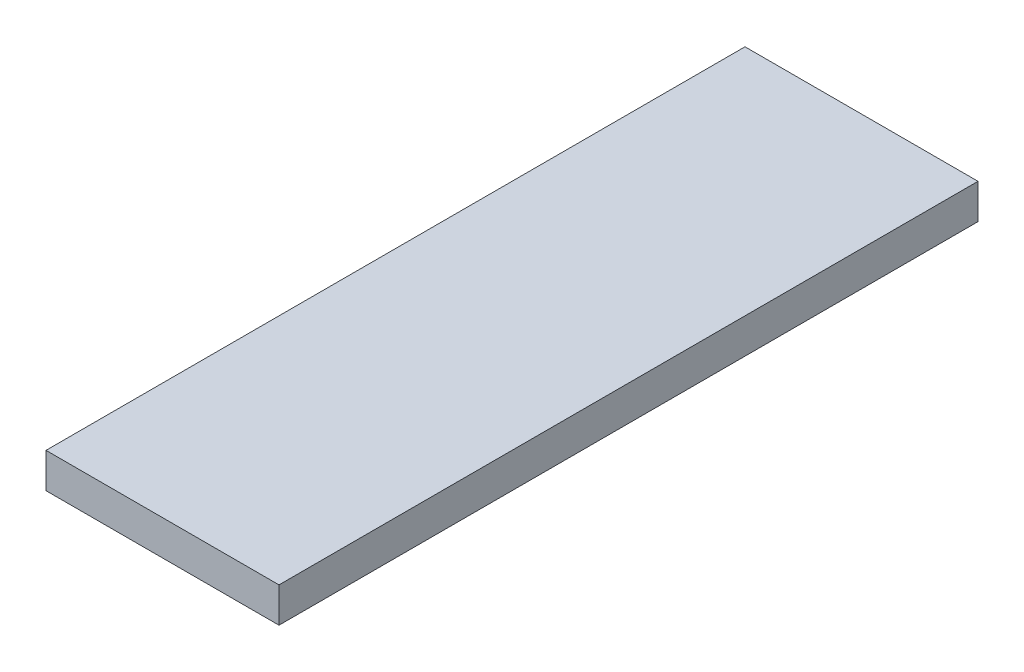
ISO-10303-21;
HEADER;
FILE_DESCRIPTION(('STEP AP214'),'2;1');
FILE_NAME('part.step','',(''),(''),'','','');
FILE_SCHEMA(('AUTOMOTIVE_DESIGN { 1 0 10303 214 1 1 1 1 }'));
ENDSEC;
DATA;
#1=APPLICATION_CONTEXT('core data for automotive mechanical design processes');
#2=APPLICATION_PROTOCOL_DEFINITION('international standard','automotive_design',2000,#1);
#3=PRODUCT_CONTEXT('',#1,'mechanical');
#4=PRODUCT('Part','Part','',(#3));
#5=PRODUCT_RELATED_PRODUCT_CATEGORY('part','',(#4));
#6=PRODUCT_DEFINITION_FORMATION('','',#4);
#7=PRODUCT_DEFINITION_CONTEXT('part definition',#1,'design');
#8=PRODUCT_DEFINITION('design','',#6,#7);
#9=PRODUCT_DEFINITION_SHAPE('','',#8);
#10=(LENGTH_UNIT() NAMED_UNIT(*) SI_UNIT(.MILLI.,.METRE.));
#11=(NAMED_UNIT(*) PLANE_ANGLE_UNIT() SI_UNIT($,.RADIAN.));
#12=(NAMED_UNIT(*) SI_UNIT($,.STERADIAN.) SOLID_ANGLE_UNIT());
#13=UNCERTAINTY_MEASURE_WITH_UNIT(LENGTH_MEASURE(1.E-05),#10,'distance_accuracy_value','');
#14=(GEOMETRIC_REPRESENTATION_CONTEXT(3) GLOBAL_UNCERTAINTY_ASSIGNED_CONTEXT((#13)) GLOBAL_UNIT_ASSIGNED_CONTEXT((#10,
#11,#12)) REPRESENTATION_CONTEXT('',''));
#15=CARTESIAN_POINT('',(0.,0.,0.));
#16=DIRECTION('',(0.,0.,1.));
#17=DIRECTION('',(1.,0.,0.));
#18=AXIS2_PLACEMENT_3D('',#15,#16,#17);
#19=CARTESIAN_POINT('',(0.,0.,60.));
#20=DIRECTION('',(0.,-1.,0.));
#21=DIRECTION('',(0.,0.,-1.));
#22=AXIS2_PLACEMENT_3D('',#19,#20,#21);
#23=PLANE('',#22);
#24=DIRECTION('',(-1.,0.,0.));
#25=VECTOR('',#24,1.);
#26=CARTESIAN_POINT('',(0.,0.,0.));
#27=LINE('',#26,#25);
#28=CARTESIAN_POINT('',(20.,0.,0.));
#29=VERTEX_POINT('',#28);
#30=CARTESIAN_POINT('',(0.,0.,0.));
#31=VERTEX_POINT('',#30);
#32=EDGE_CURVE('E96',#29,#31,#27,.T.);
#33=ORIENTED_EDGE('',*,*,#32,.T.);
#34=DIRECTION('',(0.,0.,-1.));
#35=VECTOR('',#34,1.);
#36=CARTESIAN_POINT('',(0.,0.,60.));
#37=LINE('',#36,#35);
#38=CARTESIAN_POINT('',(0.,0.,60.));
#39=VERTEX_POINT('',#38);
#40=EDGE_CURVE('E11',#39,#31,#37,.T.);
#41=ORIENTED_EDGE('',*,*,#40,.F.);
#42=DIRECTION('',(-1.,0.,0.));
#43=VECTOR('',#42,1.);
#44=CARTESIAN_POINT('',(0.,0.,60.));
#45=LINE('',#44,#43);
#46=CARTESIAN_POINT('',(20.,0.,60.));
#47=VERTEX_POINT('',#46);
#48=EDGE_CURVE('E84',#47,#39,#45,.T.);
#49=ORIENTED_EDGE('',*,*,#48,.F.);
#50=DIRECTION('',(0.,0.,-1.));
#51=VECTOR('',#50,1.);
#52=CARTESIAN_POINT('',(20.,0.,60.));
#53=LINE('',#52,#51);
#54=EDGE_CURVE('E92',#47,#29,#53,.T.);
#55=ORIENTED_EDGE('',*,*,#54,.T.);
#56=EDGE_LOOP('',(#33,#41,#49,#55));
#57=FACE_BOUND('',#56,.T.);
#58=ADVANCED_FACE('F33',(#57),#23,.F.);
#59=CARTESIAN_POINT('',(0.,0.,60.));
#60=DIRECTION('',(1.,0.,0.));
#61=DIRECTION('',(0.,1.,0.));
#62=AXIS2_PLACEMENT_3D('',#59,#60,#61);
#63=PLANE('',#62);
#64=DIRECTION('',(0.,-1.,0.));
#65=VECTOR('',#64,1.);
#66=CARTESIAN_POINT('',(0.,0.,0.));
#67=LINE('',#66,#65);
#68=CARTESIAN_POINT('',(0.,-3.,0.));
#69=VERTEX_POINT('',#68);
#70=EDGE_CURVE('E88',#31,#69,#67,.T.);
#71=ORIENTED_EDGE('',*,*,#70,.T.);
#72=DIRECTION('',(0.,0.,-1.));
#73=VECTOR('',#72,1.);
#74=CARTESIAN_POINT('',(0.,-3.,60.));
#75=LINE('',#74,#73);
#76=CARTESIAN_POINT('',(0.,-3.,60.));
#77=VERTEX_POINT('',#76);
#78=EDGE_CURVE('E41',#77,#69,#75,.T.);
#79=ORIENTED_EDGE('',*,*,#78,.F.);
#80=DIRECTION('',(0.,-1.,0.));
#81=VECTOR('',#80,1.);
#82=CARTESIAN_POINT('',(0.,0.,60.));
#83=LINE('',#82,#81);
#84=EDGE_CURVE('E79',#39,#77,#83,.T.);
#85=ORIENTED_EDGE('',*,*,#84,.F.);
#86=ORIENTED_EDGE('',*,*,#40,.T.);
#87=EDGE_LOOP('',(#71,#79,#85,#86));
#88=FACE_BOUND('',#87,.T.);
#89=ADVANCED_FACE('F87',(#88),#63,.F.);
#90=CARTESIAN_POINT('',(0.,-3.,60.));
#91=DIRECTION('',(0.,1.,0.));
#92=DIRECTION('',(0.,0.,1.));
#93=AXIS2_PLACEMENT_3D('',#90,#91,#92);
#94=PLANE('',#93);
#95=DIRECTION('',(1.,0.,0.));
#96=VECTOR('',#95,1.);
#97=CARTESIAN_POINT('',(0.,-3.,0.));
#98=LINE('',#97,#96);
#99=CARTESIAN_POINT('',(20.,-3.,0.));
#100=VERTEX_POINT('',#99);
#101=EDGE_CURVE('E66',#69,#100,#98,.T.);
#102=ORIENTED_EDGE('',*,*,#101,.T.);
#103=DIRECTION('',(0.,0.,-1.));
#104=VECTOR('',#103,1.);
#105=CARTESIAN_POINT('',(20.,-3.,60.));
#106=LINE('',#105,#104);
#107=CARTESIAN_POINT('',(20.,-3.,60.));
#108=VERTEX_POINT('',#107);
#109=EDGE_CURVE('E89',#108,#100,#106,.T.);
#110=ORIENTED_EDGE('',*,*,#109,.F.);
#111=DIRECTION('',(1.,0.,0.));
#112=VECTOR('',#111,1.);
#113=CARTESIAN_POINT('',(0.,-3.,60.));
#114=LINE('',#113,#112);
#115=EDGE_CURVE('E82',#77,#108,#114,.T.);
#116=ORIENTED_EDGE('',*,*,#115,.F.);
#117=ORIENTED_EDGE('',*,*,#78,.T.);
#118=EDGE_LOOP('',(#102,#110,#116,#117));
#119=FACE_BOUND('',#118,.T.);
#120=ADVANCED_FACE('F90',(#119),#94,.F.);
#121=CARTESIAN_POINT('',(20.,0.,60.));
#122=DIRECTION('',(-1.,0.,0.));
#123=DIRECTION('',(0.,0.,1.));
#124=AXIS2_PLACEMENT_3D('',#121,#122,#123);
#125=PLANE('',#124);
#126=DIRECTION('',(0.,1.,0.));
#127=VECTOR('',#126,1.);
#128=CARTESIAN_POINT('',(20.,0.,0.));
#129=LINE('',#128,#127);
#130=EDGE_CURVE('E72',#100,#29,#129,.T.);
#131=ORIENTED_EDGE('',*,*,#130,.T.);
#132=ORIENTED_EDGE('',*,*,#54,.F.);
#133=DIRECTION('',(0.,1.,0.));
#134=VECTOR('',#133,1.);
#135=CARTESIAN_POINT('',(20.,0.,60.));
#136=LINE('',#135,#134);
#137=EDGE_CURVE('E49',#108,#47,#136,.T.);
#138=ORIENTED_EDGE('',*,*,#137,.F.);
#139=ORIENTED_EDGE('',*,*,#109,.T.);
#140=EDGE_LOOP('',(#131,#132,#138,#139));
#141=FACE_BOUND('',#140,.T.);
#142=ADVANCED_FACE('F103',(#141),#125,.F.);
#143=CARTESIAN_POINT('',(0.,0.,60.));
#144=DIRECTION('',(0.,0.,-1.));
#145=DIRECTION('',(-1.,0.,0.));
#146=AXIS2_PLACEMENT_3D('',#143,#144,#145);
#147=PLANE('',#146);
#148=ORIENTED_EDGE('',*,*,#48,.T.);
#149=ORIENTED_EDGE('',*,*,#84,.T.);
#150=ORIENTED_EDGE('',*,*,#115,.T.);
#151=ORIENTED_EDGE('',*,*,#137,.T.);
#152=EDGE_LOOP('',(#148,#149,#150,#151));
#153=FACE_BOUND('',#152,.T.);
#154=ADVANCED_FACE('F80',(#153),#147,.F.);
#155=CARTESIAN_POINT('',(0.,0.,0.));
#156=DIRECTION('',(0.,0.,-1.));
#157=DIRECTION('',(-1.,0.,0.));
#158=AXIS2_PLACEMENT_3D('',#155,#156,#157);
#159=PLANE('',#158);
#160=ORIENTED_EDGE('',*,*,#32,.F.);
#161=ORIENTED_EDGE('',*,*,#130,.F.);
#162=ORIENTED_EDGE('',*,*,#101,.F.);
#163=ORIENTED_EDGE('',*,*,#70,.F.);
#164=EDGE_LOOP('',(#160,#161,#162,#163));
#165=FACE_BOUND('',#164,.T.);
#166=ADVANCED_FACE('F106',(#165),#159,.T.);
#167=CLOSED_SHELL('',(#58,#89,#120,#142,#154,#166));
#168=MANIFOLD_SOLID_BREP('B2',#167);
#169=ADVANCED_BREP_SHAPE_REPRESENTATION('',(#18,#168),#14);
#170=SHAPE_DEFINITION_REPRESENTATION(#9,#169);
ENDSEC;
END-ISO-10303-21;
